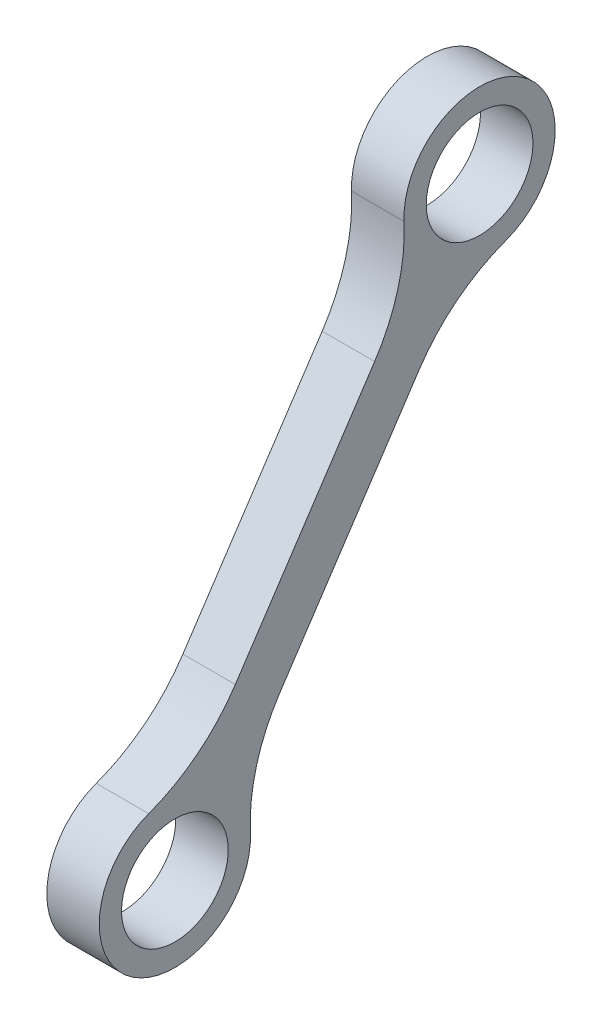
ISO-10303-21;
HEADER;
FILE_DESCRIPTION(('STEP AP214'),'2;1');
FILE_NAME('part.step','',(''),(''),'','','');
FILE_SCHEMA(('AUTOMOTIVE_DESIGN { 1 0 10303 214 1 1 1 1 }'));
ENDSEC;
DATA;
#1=APPLICATION_CONTEXT('core data for automotive mechanical design processes');
#2=APPLICATION_PROTOCOL_DEFINITION('international standard','automotive_design',2000,#1);
#3=PRODUCT_CONTEXT('',#1,'mechanical');
#4=PRODUCT('Part','Part','',(#3));
#5=PRODUCT_RELATED_PRODUCT_CATEGORY('part','',(#4));
#6=PRODUCT_DEFINITION_FORMATION('','',#4);
#7=PRODUCT_DEFINITION_CONTEXT('part definition',#1,'design');
#8=PRODUCT_DEFINITION('design','',#6,#7);
#9=PRODUCT_DEFINITION_SHAPE('','',#8);
#10=(LENGTH_UNIT() NAMED_UNIT(*) SI_UNIT(.MILLI.,.METRE.));
#11=(NAMED_UNIT(*) PLANE_ANGLE_UNIT() SI_UNIT($,.RADIAN.));
#12=(NAMED_UNIT(*) SI_UNIT($,.STERADIAN.) SOLID_ANGLE_UNIT());
#13=UNCERTAINTY_MEASURE_WITH_UNIT(LENGTH_MEASURE(1.E-05),#10,'distance_accuracy_value','');
#14=(GEOMETRIC_REPRESENTATION_CONTEXT(3) GLOBAL_UNCERTAINTY_ASSIGNED_CONTEXT((#13)) GLOBAL_UNIT_ASSIGNED_CONTEXT((#10,
#11,#12)) REPRESENTATION_CONTEXT('',''));
#15=CARTESIAN_POINT('',(0.,0.,0.));
#16=DIRECTION('',(0.,0.,1.));
#17=DIRECTION('',(1.,0.,0.));
#18=AXIS2_PLACEMENT_3D('',#15,#16,#17);
#19=CARTESIAN_POINT('',(-13.5208152801713,-22.4670219332201,104.015220775518));
#20=DIRECTION('',(1.,0.,0.));
#21=DIRECTION('',(0.,-0.833410138248846,0.552654993159421));
#22=AXIS2_PLACEMENT_3D('',#19,#20,#21);
#23=CYLINDRICAL_SURFACE('',#22,10.);
#24=CARTESIAN_POINT('',(-1.45000000000002,-22.4670219332201,104.015220775518));
#25=DIRECTION('',(1.,0.,0.));
#26=DIRECTION('',(0.,-0.833410138248846,0.552654993159421));
#27=AXIS2_PLACEMENT_3D('',#24,#25,#26);
#28=CIRCLE('',#27,10.);
#29=CARTESIAN_POINT('',(-1.45000000000001,-31.8485604262004,100.553034254729));
#30=VERTEX_POINT('',#29);
#31=CARTESIAN_POINT('',(-1.45000000000001,-27.9935718648143,95.6811193930291));
#32=VERTEX_POINT('',#31);
#33=EDGE_CURVE('E203',#30,#32,#28,.T.);
#34=ORIENTED_EDGE('',*,*,#33,.F.);
#35=DIRECTION('',(-1.,0.,0.));
#36=VECTOR('',#35,1.);
#37=CARTESIAN_POINT('',(-13.5208152801713,-31.8485604262004,100.553034254729));
#38=LINE('',#37,#36);
#39=CARTESIAN_POINT('',(1.49999999999999,-31.8485604262004,100.553034254729));
#40=VERTEX_POINT('',#39);
#41=EDGE_CURVE('E11',#40,#30,#38,.T.);
#42=ORIENTED_EDGE('',*,*,#41,.F.);
#43=CARTESIAN_POINT('',(1.49999999999998,-22.4670219332201,104.015220775518));
#44=DIRECTION('',(-1.,0.,0.));
#45=DIRECTION('',(0.,-0.833410138248844,0.552654993159424));
#46=AXIS2_PLACEMENT_3D('',#43,#44,#45);
#47=CIRCLE('',#46,10.);
#48=CARTESIAN_POINT('',(1.49999999999999,-27.9935718648143,95.6811193930291));
#49=VERTEX_POINT('',#48);
#50=EDGE_CURVE('E151',#49,#40,#47,.T.);
#51=ORIENTED_EDGE('',*,*,#50,.F.);
#52=DIRECTION('',(1.,0.,0.));
#53=VECTOR('',#52,1.);
#54=CARTESIAN_POINT('',(1.49999999999999,-27.9935718648143,95.6811193930291));
#55=LINE('',#54,#53);
#56=EDGE_CURVE('E163',#32,#49,#55,.T.);
#57=ORIENTED_EDGE('',*,*,#56,.F.);
#58=EDGE_LOOP('',(#34,#42,#51,#57));
#59=FACE_BOUND('',#58,.T.);
#60=ADVANCED_FACE('F36',(#59),#23,.F.);
#61=CARTESIAN_POINT('',(-13.5208152801713,-10.657627509833,96.1841175830518));
#62=DIRECTION('',(1.,0.,0.));
#63=DIRECTION('',(0.,-0.833410138248846,0.552654993159421));
#64=AXIS2_PLACEMENT_3D('',#61,#62,#63);
#65=CYLINDRICAL_SURFACE('',#64,10.);
#66=CARTESIAN_POINT('',(1.49999999999997,-10.657627509833,96.1841175830518));
#67=DIRECTION('',(-1.,0.,0.));
#68=DIRECTION('',(0.,-0.833410138248846,0.552654993159421));
#69=AXIS2_PLACEMENT_3D('',#66,#67,#68);
#70=CIRCLE('',#69,10.);
#71=CARTESIAN_POINT('',(1.49999999999997,-10.1961345204772,86.194772047894));
#72=VERTEX_POINT('',#71);
#73=CARTESIAN_POINT('',(1.49999999999998,-16.1841774414271,87.8500162005633));
#74=VERTEX_POINT('',#73);
#75=EDGE_CURVE('E140',#72,#74,#70,.T.);
#76=ORIENTED_EDGE('',*,*,#75,.F.);
#77=DIRECTION('',(1.,0.,0.));
#78=VECTOR('',#77,1.);
#79=CARTESIAN_POINT('',(-13.5208152801713,-10.1961345204785,86.194772047894));
#80=LINE('',#79,#78);
#81=CARTESIAN_POINT('',(-1.45000000000003,-10.1961345204784,86.194772047894));
#82=VERTEX_POINT('',#81);
#83=EDGE_CURVE('E182',#82,#72,#80,.T.);
#84=ORIENTED_EDGE('',*,*,#83,.F.);
#85=CARTESIAN_POINT('',(-1.45000000000003,-10.657627509833,96.1841175830518));
#86=DIRECTION('',(1.,0.,0.));
#87=DIRECTION('',(0.,-0.833410138248846,0.552654993159421));
#88=AXIS2_PLACEMENT_3D('',#85,#86,#87);
#89=CIRCLE('',#88,10.);
#90=CARTESIAN_POINT('',(-1.45000000000002,-16.1841774414272,87.8500162005633));
#91=VERTEX_POINT('',#90);
#92=EDGE_CURVE('E158',#91,#82,#89,.T.);
#93=ORIENTED_EDGE('',*,*,#92,.F.);
#94=DIRECTION('',(-1.,0.,0.));
#95=VECTOR('',#94,1.);
#96=CARTESIAN_POINT('',(1.49999999999998,-16.1841774414272,87.8500162005633));
#97=LINE('',#96,#95);
#98=EDGE_CURVE('E155',#74,#91,#97,.T.);
#99=ORIENTED_EDGE('',*,*,#98,.F.);
#100=EDGE_LOOP('',(#76,#84,#93,#99));
#101=FACE_BOUND('',#100,.T.);
#102=ADVANCED_FACE('F156',(#101),#65,.F.);
#103=CARTESIAN_POINT('',(-13.5208152801713,-23.3686923524997,77.0156844033283));
#104=DIRECTION('',(1.,0.,0.));
#105=DIRECTION('',(0.,-0.833410138248846,0.552654993159421));
#106=AXIS2_PLACEMENT_3D('',#103,#104,#105);
#107=CYLINDRICAL_SURFACE('',#106,10.);
#108=CARTESIAN_POINT('',(-1.45000000000001,-23.3686923524996,77.0156844033283));
#109=DIRECTION('',(1.,0.,0.));
#110=DIRECTION('',(0.,-0.833410138248846,0.552654993159421));
#111=AXIS2_PLACEMENT_3D('',#108,#109,#110);
#112=CIRCLE('',#111,10.);
#113=CARTESIAN_POINT('',(-1.45000000000003,-13.9871538595194,80.4778709241169));
#114=VERTEX_POINT('',#113);
#115=CARTESIAN_POINT('',(-1.45000000000002,-17.8421424209054,85.3497857858168));
#116=VERTEX_POINT('',#115);
#117=EDGE_CURVE('E212',#114,#116,#112,.T.);
#118=ORIENTED_EDGE('',*,*,#117,.F.);
#119=DIRECTION('',(-1.,0.,0.));
#120=VECTOR('',#119,1.);
#121=CARTESIAN_POINT('',(-13.5208152801713,-13.9871538595194,80.4778709241169));
#122=LINE('',#121,#120);
#123=CARTESIAN_POINT('',(1.49999999999997,-13.9871538595194,80.4778709241169));
#124=VERTEX_POINT('',#123);
#125=EDGE_CURVE('E180',#124,#114,#122,.T.);
#126=ORIENTED_EDGE('',*,*,#125,.F.);
#127=CARTESIAN_POINT('',(1.49999999999999,-23.3686923524996,77.0156844033283));
#128=DIRECTION('',(-1.,0.,0.));
#129=DIRECTION('',(0.,-0.833410138248846,0.552654993159421));
#130=AXIS2_PLACEMENT_3D('',#127,#128,#129);
#131=CIRCLE('',#130,10.);
#132=CARTESIAN_POINT('',(1.49999999999998,-17.8421424209054,85.3497857858168));
#133=VERTEX_POINT('',#132);
#134=EDGE_CURVE('E234',#133,#124,#131,.T.);
#135=ORIENTED_EDGE('',*,*,#134,.F.);
#136=DIRECTION('',(1.,0.,0.));
#137=VECTOR('',#136,1.);
#138=CARTESIAN_POINT('',(1.49999999999998,-17.8421424209054,85.3497857858168));
#139=LINE('',#138,#137);
#140=EDGE_CURVE('E219',#116,#133,#139,.T.);
#141=ORIENTED_EDGE('',*,*,#140,.F.);
#142=EDGE_LOOP('',(#118,#126,#135,#141));
#143=FACE_BOUND('',#142,.T.);
#144=ADVANCED_FACE('F38',(#143),#107,.F.);
#145=CARTESIAN_POINT('',(-13.5208152801713,-35.1780867758868,84.8467875957942));
#146=DIRECTION('',(1.,0.,0.));
#147=DIRECTION('',(0.,-0.833410138248846,0.552654993159421));
#148=AXIS2_PLACEMENT_3D('',#145,#146,#147);
#149=CYLINDRICAL_SURFACE('',#148,10.);
#150=CARTESIAN_POINT('',(1.5,-35.1780867758868,84.8467875957941));
#151=DIRECTION('',(-1.,0.,0.));
#152=DIRECTION('',(0.,-0.833410138248846,0.552654993159421));
#153=AXIS2_PLACEMENT_3D('',#150,#151,#152);
#154=CIRCLE('',#153,10.);
#155=CARTESIAN_POINT('',(1.5,-35.6395797652413,94.8361331309519));
#156=VERTEX_POINT('',#155);
#157=CARTESIAN_POINT('',(1.49999999999999,-29.6515368442926,93.1808889782826));
#158=VERTEX_POINT('',#157);
#159=EDGE_CURVE('E40',#156,#158,#154,.T.);
#160=ORIENTED_EDGE('',*,*,#159,.F.);
#161=DIRECTION('',(1.,0.,0.));
#162=VECTOR('',#161,1.);
#163=CARTESIAN_POINT('',(-13.5208152801713,-35.6395797652414,94.8361331309519));
#164=LINE('',#163,#162);
#165=CARTESIAN_POINT('',(-1.45,-35.6395797652413,94.8361331309519));
#166=VERTEX_POINT('',#165);
#167=EDGE_CURVE('E47',#166,#156,#164,.T.);
#168=ORIENTED_EDGE('',*,*,#167,.F.);
#169=CARTESIAN_POINT('',(-1.45,-35.1780867758868,84.8467875957941));
#170=DIRECTION('',(1.,0.,0.));
#171=DIRECTION('',(0.,-0.833410138248846,0.552654993159421));
#172=AXIS2_PLACEMENT_3D('',#169,#170,#171);
#173=CIRCLE('',#172,10.);
#174=CARTESIAN_POINT('',(-1.45000000000001,-29.6515368442926,93.1808889782826));
#175=VERTEX_POINT('',#174);
#176=EDGE_CURVE('E202',#175,#166,#173,.T.);
#177=ORIENTED_EDGE('',*,*,#176,.F.);
#178=DIRECTION('',(-1.,0.,0.));
#179=VECTOR('',#178,1.);
#180=CARTESIAN_POINT('',(1.49999999999999,-29.6515368442926,93.1808889782826));
#181=LINE('',#180,#179);
#182=EDGE_CURVE('E220',#158,#175,#181,.T.);
#183=ORIENTED_EDGE('',*,*,#182,.F.);
#184=EDGE_LOOP('',(#160,#168,#177,#183));
#185=FACE_BOUND('',#184,.T.);
#186=ADVANCED_FACE('F290',(#185),#149,.F.);
#187=CARTESIAN_POINT('',(1.49999999999997,-10.0000000000028,81.949300195452));
#188=DIRECTION('',(1.,0.,0.));
#189=DIRECTION('',(0.,-0.833410138248846,0.552654993159421));
#190=AXIS2_PLACEMENT_3D('',#187,#188,#189);
#191=CYLINDRICAL_SURFACE('',#190,3.);
#192=CARTESIAN_POINT('',(-1.45000000000003,-10.0000000000028,81.949300195452));
#193=DIRECTION('',(1.,0.,0.));
#194=DIRECTION('',(0.,-0.833410138248846,0.552654993159421));
#195=AXIS2_PLACEMENT_3D('',#192,#193,#194);
#196=CIRCLE('',#195,3.);
#197=CARTESIAN_POINT('',(-1.45000000000003,-12.5002304147493,83.6072651749302));
#198=VERTEX_POINT('',#197);
#199=EDGE_CURVE('E174',#198,#198,#196,.T.);
#200=ORIENTED_EDGE('',*,*,#199,.F.);
#201=EDGE_LOOP('',(#200));
#202=FACE_BOUND('',#201,.T.);
#203=CARTESIAN_POINT('',(1.49999999999997,-10.0000000000028,81.949300195452));
#204=DIRECTION('',(1.,0.,0.));
#205=DIRECTION('',(0.,-0.833410138248846,0.552654993159421));
#206=AXIS2_PLACEMENT_3D('',#203,#204,#205);
#207=CIRCLE('',#206,3.);
#208=CARTESIAN_POINT('',(1.49999999999997,-12.5002304147493,83.6072651749302));
#209=VERTEX_POINT('',#208);
#210=EDGE_CURVE('E181',#209,#209,#207,.T.);
#211=ORIENTED_EDGE('',*,*,#210,.T.);
#212=EDGE_LOOP('',(#211));
#213=FACE_BOUND('',#212,.T.);
#214=ADVANCED_FACE('F287',(#202,#213),#191,.F.);
#215=CARTESIAN_POINT('',(1.5,-35.835714285717,99.081604983394));
#216=DIRECTION('',(1.,0.,0.));
#217=DIRECTION('',(0.,-0.833410138248846,0.552654993159421));
#218=AXIS2_PLACEMENT_3D('',#215,#216,#217);
#219=CYLINDRICAL_SURFACE('',#218,3.);
#220=CARTESIAN_POINT('',(-1.45,-35.835714285717,99.081604983394));
#221=DIRECTION('',(1.,0.,0.));
#222=DIRECTION('',(0.,-0.833410138248846,0.552654993159421));
#223=AXIS2_PLACEMENT_3D('',#220,#221,#222);
#224=CIRCLE('',#223,3.);
#225=CARTESIAN_POINT('',(-1.45,-38.3359447004635,100.739569962872));
#226=VERTEX_POINT('',#225);
#227=EDGE_CURVE('E168',#226,#226,#224,.T.);
#228=ORIENTED_EDGE('',*,*,#227,.F.);
#229=EDGE_LOOP('',(#228));
#230=FACE_BOUND('',#229,.T.);
#231=CARTESIAN_POINT('',(1.5,-35.835714285717,99.081604983394));
#232=DIRECTION('',(1.,0.,0.));
#233=DIRECTION('',(0.,-0.833410138248846,0.552654993159421));
#234=AXIS2_PLACEMENT_3D('',#231,#232,#233);
#235=CIRCLE('',#234,3.);
#236=CARTESIAN_POINT('',(1.5,-38.3359447004636,100.739569962872));
#237=VERTEX_POINT('',#236);
#238=EDGE_CURVE('E58',#237,#237,#235,.T.);
#239=ORIENTED_EDGE('',*,*,#238,.T.);
#240=EDGE_LOOP('',(#239));
#241=FACE_BOUND('',#240,.T.);
#242=ADVANCED_FACE('F254',(#230,#241),#219,.F.);
#243=CARTESIAN_POINT('',(-13.5208152801713,-35.835714285717,99.081604983394));
#244=DIRECTION('',(1.,0.,0.));
#245=DIRECTION('',(0.,-0.833410138248846,0.552654993159421));
#246=AXIS2_PLACEMENT_3D('',#243,#244,#245);
#247=CYLINDRICAL_SURFACE('',#246,4.25);
#248=CARTESIAN_POINT('',(-1.45,-35.835714285717,99.081604983394));
#249=DIRECTION('',(-1.,0.,0.));
#250=DIRECTION('',(0.,-0.833410138248846,0.552654993159421));
#251=AXIS2_PLACEMENT_3D('',#248,#249,#250);
#252=CIRCLE('',#251,4.25);
#253=EDGE_CURVE('E207',#166,#30,#252,.T.);
#254=ORIENTED_EDGE('',*,*,#253,.F.);
#255=ORIENTED_EDGE('',*,*,#167,.T.);
#256=CARTESIAN_POINT('',(1.5,-35.835714285717,99.081604983394));
#257=DIRECTION('',(1.,0.,0.));
#258=DIRECTION('',(0.,-0.833410138248846,0.552654993159421));
#259=AXIS2_PLACEMENT_3D('',#256,#257,#258);
#260=CIRCLE('',#259,4.25);
#261=EDGE_CURVE('E274',#40,#156,#260,.T.);
#262=ORIENTED_EDGE('',*,*,#261,.F.);
#263=ORIENTED_EDGE('',*,*,#41,.T.);
#264=EDGE_LOOP('',(#254,#255,#262,#263));
#265=FACE_BOUND('',#264,.T.);
#266=ADVANCED_FACE('F246',(#265),#247,.T.);
#267=CARTESIAN_POINT('',(-13.5208152801713,-10.0000000000028,81.9493001954519));
#268=DIRECTION('',(1.,0.,0.));
#269=DIRECTION('',(0.,-0.833410138248846,0.552654993159421));
#270=AXIS2_PLACEMENT_3D('',#267,#268,#269);
#271=CYLINDRICAL_SURFACE('',#270,4.25);
#272=CARTESIAN_POINT('',(1.49999999999997,-10.0000000000028,81.949300195452));
#273=DIRECTION('',(1.,0.,0.));
#274=DIRECTION('',(0.,-0.833410138248846,0.552654993159421));
#275=AXIS2_PLACEMENT_3D('',#272,#273,#274);
#276=CIRCLE('',#275,4.25);
#277=EDGE_CURVE('E148',#124,#72,#276,.T.);
#278=ORIENTED_EDGE('',*,*,#277,.F.);
#279=ORIENTED_EDGE('',*,*,#125,.T.);
#280=CARTESIAN_POINT('',(-1.45000000000003,-10.0000000000028,81.949300195452));
#281=DIRECTION('',(-1.,0.,0.));
#282=DIRECTION('',(0.,-0.833410138248846,0.552654993159421));
#283=AXIS2_PLACEMENT_3D('',#280,#281,#282);
#284=CIRCLE('',#283,4.25);
#285=EDGE_CURVE('E216',#82,#114,#284,.T.);
#286=ORIENTED_EDGE('',*,*,#285,.F.);
#287=ORIENTED_EDGE('',*,*,#83,.T.);
#288=EDGE_LOOP('',(#278,#279,#286,#287));
#289=FACE_BOUND('',#288,.T.);
#290=ADVANCED_FACE('F244',(#289),#271,.T.);
#291=CARTESIAN_POINT('',(1.5,-35.835714285717,99.081604983394));
#292=DIRECTION('',(1.,0.,0.));
#293=DIRECTION('',(0.,0.552654993159421,0.833410138248846));
#294=AXIS2_PLACEMENT_3D('',#291,#292,#293);
#295=PLANE('',#294);
#296=ORIENTED_EDGE('',*,*,#238,.F.);
#297=EDGE_LOOP('',(#296));
#298=FACE_BOUND('',#297,.T.);
#299=ORIENTED_EDGE('',*,*,#210,.F.);
#300=EDGE_LOOP('',(#299));
#301=FACE_BOUND('',#300,.T.);
#302=ORIENTED_EDGE('',*,*,#277,.T.);
#303=ORIENTED_EDGE('',*,*,#75,.T.);
#304=DIRECTION('',(0.,-0.833410138248846,0.552654993159421));
#305=VECTOR('',#304,1.);
#306=CARTESIAN_POINT('',(1.5,-35.0067317959779,100.331720190767));
#307=LINE('',#306,#305);
#308=EDGE_CURVE('E145',#74,#49,#307,.T.);
#309=ORIENTED_EDGE('',*,*,#308,.T.);
#310=ORIENTED_EDGE('',*,*,#50,.T.);
#311=ORIENTED_EDGE('',*,*,#261,.T.);
#312=ORIENTED_EDGE('',*,*,#159,.T.);
#313=DIRECTION('',(0.,0.833410138248846,-0.552654993159421));
#314=VECTOR('',#313,1.);
#315=CARTESIAN_POINT('',(1.5,-36.6646967754561,97.8314897760207));
#316=LINE('',#315,#314);
#317=EDGE_CURVE('E178',#158,#133,#316,.T.);
#318=ORIENTED_EDGE('',*,*,#317,.T.);
#319=ORIENTED_EDGE('',*,*,#134,.T.);
#320=EDGE_LOOP('',(#302,#303,#309,#310,#311,#312,#318,#319));
#321=FACE_BOUND('',#320,.T.);
#322=ADVANCED_FACE('F142',(#298,#301,#321),#295,.T.);
#323=CARTESIAN_POINT('',(1.5,-36.6646967754561,97.8314897760207));
#324=DIRECTION('',(0.,0.552654993159421,0.833410138248846));
#325=DIRECTION('',(-1.,0.,0.));
#326=AXIS2_PLACEMENT_3D('',#323,#324,#325);
#327=PLANE('',#326);
#328=ORIENTED_EDGE('',*,*,#317,.F.);
#329=ORIENTED_EDGE('',*,*,#182,.T.);
#330=DIRECTION('',(0.,0.833410138248846,-0.552654993159421));
#331=VECTOR('',#330,1.);
#332=CARTESIAN_POINT('',(-1.45,-36.6646967754561,97.8314897760207));
#333=LINE('',#332,#331);
#334=EDGE_CURVE('E199',#175,#116,#333,.T.);
#335=ORIENTED_EDGE('',*,*,#334,.T.);
#336=ORIENTED_EDGE('',*,*,#140,.T.);
#337=EDGE_LOOP('',(#328,#329,#335,#336));
#338=FACE_BOUND('',#337,.T.);
#339=ADVANCED_FACE('F238',(#338),#327,.F.);
#340=CARTESIAN_POINT('',(1.5,-35.0067317959779,100.331720190767));
#341=DIRECTION('',(0.,-0.552654993159421,-0.833410138248846));
#342=DIRECTION('',(0.,-0.833410138248846,0.552654993159421));
#343=AXIS2_PLACEMENT_3D('',#340,#341,#342);
#344=PLANE('',#343);
#345=ORIENTED_EDGE('',*,*,#308,.F.);
#346=ORIENTED_EDGE('',*,*,#98,.T.);
#347=DIRECTION('',(0.,-0.833410138248846,0.552654993159421));
#348=VECTOR('',#347,1.);
#349=CARTESIAN_POINT('',(-1.45,-35.0067317959779,100.331720190767));
#350=LINE('',#349,#348);
#351=EDGE_CURVE('E206',#91,#32,#350,.T.);
#352=ORIENTED_EDGE('',*,*,#351,.T.);
#353=ORIENTED_EDGE('',*,*,#56,.T.);
#354=EDGE_LOOP('',(#345,#346,#352,#353));
#355=FACE_BOUND('',#354,.T.);
#356=ADVANCED_FACE('F166',(#355),#344,.F.);
#357=CARTESIAN_POINT('',(-1.45,-35.835714285717,99.081604983394));
#358=DIRECTION('',(1.,0.,0.));
#359=DIRECTION('',(0.,0.552654993159421,0.833410138248846));
#360=AXIS2_PLACEMENT_3D('',#357,#358,#359);
#361=PLANE('',#360);
#362=ORIENTED_EDGE('',*,*,#227,.T.);
#363=EDGE_LOOP('',(#362));
#364=FACE_BOUND('',#363,.T.);
#365=ORIENTED_EDGE('',*,*,#199,.T.);
#366=EDGE_LOOP('',(#365));
#367=FACE_BOUND('',#366,.T.);
#368=ORIENTED_EDGE('',*,*,#334,.F.);
#369=ORIENTED_EDGE('',*,*,#176,.T.);
#370=ORIENTED_EDGE('',*,*,#253,.T.);
#371=ORIENTED_EDGE('',*,*,#33,.T.);
#372=ORIENTED_EDGE('',*,*,#351,.F.);
#373=ORIENTED_EDGE('',*,*,#92,.T.);
#374=ORIENTED_EDGE('',*,*,#285,.T.);
#375=ORIENTED_EDGE('',*,*,#117,.T.);
#376=EDGE_LOOP('',(#368,#369,#370,#371,#372,#373,#374,#375));
#377=FACE_BOUND('',#376,.T.);
#378=ADVANCED_FACE('F243',(#364,#367,#377),#361,.F.);
#379=CLOSED_SHELL('',(#60,#102,#144,#186,#214,#242,#266,#290,#322,#339,#356,#378));
#380=MANIFOLD_SOLID_BREP('B2',#379);
#381=ADVANCED_BREP_SHAPE_REPRESENTATION('',(#18,#380),#14);
#382=SHAPE_DEFINITION_REPRESENTATION(#9,#381);
ENDSEC;
END-ISO-10303-21;
